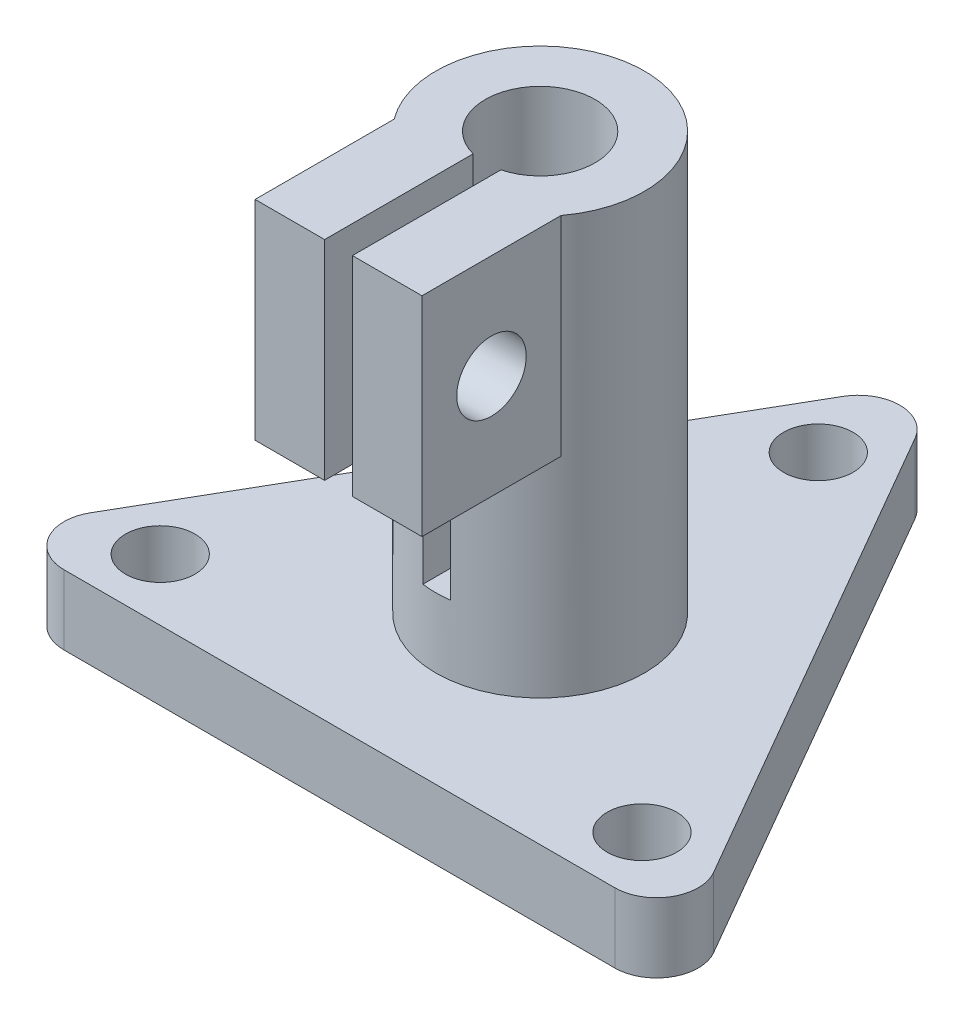
ISO-10303-21;
HEADER;
FILE_DESCRIPTION(('STEP AP214'),'2;1');
FILE_NAME('part.step','',(''),(''),'','','');
FILE_SCHEMA(('AUTOMOTIVE_DESIGN { 1 0 10303 214 1 1 1 1 }'));
ENDSEC;
DATA;
#1=APPLICATION_CONTEXT('core data for automotive mechanical design processes');
#2=APPLICATION_PROTOCOL_DEFINITION('international standard','automotive_design',2000,#1);
#3=PRODUCT_CONTEXT('',#1,'mechanical');
#4=PRODUCT('Part','Part','',(#3));
#5=PRODUCT_RELATED_PRODUCT_CATEGORY('part','',(#4));
#6=PRODUCT_DEFINITION_FORMATION('','',#4);
#7=PRODUCT_DEFINITION_CONTEXT('part definition',#1,'design');
#8=PRODUCT_DEFINITION('design','',#6,#7);
#9=PRODUCT_DEFINITION_SHAPE('','',#8);
#10=(LENGTH_UNIT() NAMED_UNIT(*) SI_UNIT(.MILLI.,.METRE.));
#11=(NAMED_UNIT(*) PLANE_ANGLE_UNIT() SI_UNIT($,.RADIAN.));
#12=(NAMED_UNIT(*) SI_UNIT($,.STERADIAN.) SOLID_ANGLE_UNIT());
#13=UNCERTAINTY_MEASURE_WITH_UNIT(LENGTH_MEASURE(1.E-05),#10,'distance_accuracy_value','');
#14=(GEOMETRIC_REPRESENTATION_CONTEXT(3) GLOBAL_UNCERTAINTY_ASSIGNED_CONTEXT((#13)) GLOBAL_UNIT_ASSIGNED_CONTEXT((#10,
#11,#12)) REPRESENTATION_CONTEXT('',''));
#15=CARTESIAN_POINT('',(0.,0.,0.));
#16=DIRECTION('',(0.,0.,1.));
#17=DIRECTION('',(1.,0.,0.));
#18=AXIS2_PLACEMENT_3D('',#15,#16,#17);
#19=CARTESIAN_POINT('',(-22.8038475772934,27.5,9.5));
#20=DIRECTION('',(1.,0.,0.));
#21=DIRECTION('',(0.,0.,-1.));
#22=AXIS2_PLACEMENT_3D('',#19,#20,#21);
#23=CYLINDRICAL_SURFACE('',#22,2.5);
#24=CARTESIAN_POINT('',(-1.,27.5,9.5));
#25=DIRECTION('',(-1.,0.,0.));
#26=DIRECTION('',(0.,0.,1.));
#27=AXIS2_PLACEMENT_3D('',#24,#25,#26);
#28=CIRCLE('',#27,2.5);
#29=CARTESIAN_POINT('',(-1.,27.5,12.));
#30=VERTEX_POINT('',#29);
#31=EDGE_CURVE('E246',#30,#30,#28,.T.);
#32=ORIENTED_EDGE('',*,*,#31,.F.);
#33=EDGE_LOOP('',(#32));
#34=FACE_BOUND('',#33,.T.);
#35=CARTESIAN_POINT('',(-1.5,27.5,9.5));
#36=DIRECTION('',(-1.,0.,0.));
#37=DIRECTION('',(0.,0.,1.));
#38=AXIS2_PLACEMENT_3D('',#35,#36,#37);
#39=CIRCLE('',#38,2.5);
#40=CARTESIAN_POINT('',(-1.5,27.5,12.));
#41=VERTEX_POINT('',#40);
#42=EDGE_CURVE('E40',#41,#41,#39,.F.);
#43=ORIENTED_EDGE('',*,*,#42,.F.);
#44=EDGE_LOOP('',(#43));
#45=FACE_BOUND('',#44,.T.);
#46=ADVANCED_FACE('F36',(#34,#45),#23,.F.);
#47=CARTESIAN_POINT('',(-6.,20.,14.5));
#48=DIRECTION('',(0.,0.,1.));
#49=DIRECTION('',(1.,0.,0.));
#50=AXIS2_PLACEMENT_3D('',#47,#48,#49);
#51=PLANE('',#50);
#52=DIRECTION('',(0.,1.,0.));
#53=VECTOR('',#52,1.);
#54=CARTESIAN_POINT('',(1.,9.99999999999999,14.5));
#55=LINE('',#54,#53);
#56=CARTESIAN_POINT('',(1.,20.,14.5));
#57=VERTEX_POINT('',#56);
#58=CARTESIAN_POINT('',(1.,35.,14.5));
#59=VERTEX_POINT('',#58);
#60=EDGE_CURVE('E268',#57,#59,#55,.T.);
#61=ORIENTED_EDGE('',*,*,#60,.F.);
#62=DIRECTION('',(1.,0.,0.));
#63=VECTOR('',#62,1.);
#64=CARTESIAN_POINT('',(-6.,20.,14.5));
#65=LINE('',#64,#63);
#66=CARTESIAN_POINT('',(6.,20.,14.5));
#67=VERTEX_POINT('',#66);
#68=EDGE_CURVE('E301',#57,#67,#65,.T.);
#69=ORIENTED_EDGE('',*,*,#68,.T.);
#70=DIRECTION('',(0.,1.,0.));
#71=VECTOR('',#70,1.);
#72=CARTESIAN_POINT('',(6.,20.,14.5));
#73=LINE('',#72,#71);
#74=CARTESIAN_POINT('',(6.,35.,14.5));
#75=VERTEX_POINT('',#74);
#76=EDGE_CURVE('E321',#67,#75,#73,.T.);
#77=ORIENTED_EDGE('',*,*,#76,.T.);
#78=DIRECTION('',(1.,0.,0.));
#79=VECTOR('',#78,1.);
#80=CARTESIAN_POINT('',(-6.,35.,14.5));
#81=LINE('',#80,#79);
#82=EDGE_CURVE('E311',#59,#75,#81,.T.);
#83=ORIENTED_EDGE('',*,*,#82,.F.);
#84=EDGE_LOOP('',(#61,#69,#77,#83));
#85=FACE_BOUND('',#84,.T.);
#86=ADVANCED_FACE('F397',(#85),#51,.T.);
#87=CARTESIAN_POINT('',(0.,20.,0.));
#88=DIRECTION('',(0.,1.,0.));
#89=DIRECTION('',(0.,0.,1.));
#90=AXIS2_PLACEMENT_3D('',#87,#88,#89);
#91=PLANE('',#90);
#92=ORIENTED_EDGE('',*,*,#68,.F.);
#93=DIRECTION('',(0.,0.,-1.));
#94=VECTOR('',#93,1.);
#95=CARTESIAN_POINT('',(1.,20.,0.));
#96=LINE('',#95,#94);
#97=CARTESIAN_POINT('',(1.,20.,7.43303437365925));
#98=VERTEX_POINT('',#97);
#99=EDGE_CURVE('E281',#57,#98,#96,.T.);
#100=ORIENTED_EDGE('',*,*,#99,.T.);
#101=CARTESIAN_POINT('',(0.,20.,0.));
#102=DIRECTION('',(0.,-1.,0.));
#103=DIRECTION('',(0.,0.,1.));
#104=AXIS2_PLACEMENT_3D('',#101,#102,#103);
#105=CIRCLE('',#104,7.5);
#106=CARTESIAN_POINT('',(6.,20.,4.5));
#107=VERTEX_POINT('',#106);
#108=EDGE_CURVE('E294',#107,#98,#105,.T.);
#109=ORIENTED_EDGE('',*,*,#108,.F.);
#110=DIRECTION('',(0.,0.,-1.));
#111=VECTOR('',#110,1.);
#112=CARTESIAN_POINT('',(6.,20.,4.5));
#113=LINE('',#112,#111);
#114=EDGE_CURVE('E305',#67,#107,#113,.T.);
#115=ORIENTED_EDGE('',*,*,#114,.F.);
#116=EDGE_LOOP('',(#92,#100,#109,#115));
#117=FACE_BOUND('',#116,.T.);
#118=ADVANCED_FACE('F449',(#117),#91,.F.);
#119=CARTESIAN_POINT('',(0.,5.,0.));
#120=DIRECTION('',(0.,1.,0.));
#121=DIRECTION('',(0.,0.,1.));
#122=AXIS2_PLACEMENT_3D('',#119,#120,#121);
#123=PLANE('',#122);
#124=CARTESIAN_POINT('',(0.,5.,0.));
#125=DIRECTION('',(0.,1.,0.));
#126=DIRECTION('',(0.,0.,1.));
#127=AXIS2_PLACEMENT_3D('',#124,#125,#126);
#128=CIRCLE('',#127,7.5);
#129=CARTESIAN_POINT('',(0.,5.,7.5));
#130=VERTEX_POINT('',#129);
#131=EDGE_CURVE('E320',#130,#130,#128,.T.);
#132=ORIENTED_EDGE('',*,*,#131,.F.);
#133=EDGE_LOOP('',(#132));
#134=FACE_BOUND('',#133,.T.);
#135=CARTESIAN_POINT('',(-17.3205080756888,5.,10.));
#136=DIRECTION('',(0.,1.,0.));
#137=DIRECTION('',(0.,0.,1.));
#138=AXIS2_PLACEMENT_3D('',#135,#136,#137);
#139=CIRCLE('',#138,2.5);
#140=CARTESIAN_POINT('',(-17.3205080756888,5.,12.5));
#141=VERTEX_POINT('',#140);
#142=EDGE_CURVE('E340',#141,#141,#139,.T.);
#143=ORIENTED_EDGE('',*,*,#142,.F.);
#144=EDGE_LOOP('',(#143));
#145=FACE_BOUND('',#144,.T.);
#146=DIRECTION('',(-0.5,0.,-0.866025403784439));
#147=VECTOR('',#146,1.);
#148=CARTESIAN_POINT('',(25.,5.,14.4337567297407));
#149=LINE('',#148,#147);
#150=CARTESIAN_POINT('',(22.4019237886467,5.,9.93375672974065));
#151=VERTEX_POINT('',#150);
#152=CARTESIAN_POINT('',(2.59807621135331,5.,-24.3675134594813));
#153=VERTEX_POINT('',#152);
#154=EDGE_CURVE('E358',#151,#153,#149,.T.);
#155=ORIENTED_EDGE('',*,*,#154,.T.);
#156=CARTESIAN_POINT('',(0.,5.,-22.8675134594813));
#157=DIRECTION('',(0.,1.,0.));
#158=DIRECTION('',(0.,0.,1.));
#159=AXIS2_PLACEMENT_3D('',#156,#157,#158);
#160=CIRCLE('',#159,3.);
#161=CARTESIAN_POINT('',(-2.59807621135331,5.,-24.3675134594813));
#162=VERTEX_POINT('',#161);
#163=EDGE_CURVE('E387',#153,#162,#160,.T.);
#164=ORIENTED_EDGE('',*,*,#163,.T.);
#165=DIRECTION('',(-0.5,0.,0.866025403784439));
#166=VECTOR('',#165,1.);
#167=CARTESIAN_POINT('',(0.,5.,-28.8675134594813));
#168=LINE('',#167,#166);
#169=CARTESIAN_POINT('',(-22.4019237886467,5.,9.93375672974065));
#170=VERTEX_POINT('',#169);
#171=EDGE_CURVE('E352',#162,#170,#168,.T.);
#172=ORIENTED_EDGE('',*,*,#171,.T.);
#173=CARTESIAN_POINT('',(-19.8038475772934,5.,11.4337567297406));
#174=DIRECTION('',(0.,1.,0.));
#175=DIRECTION('',(0.,0.,1.));
#176=AXIS2_PLACEMENT_3D('',#173,#174,#175);
#177=CIRCLE('',#176,3.);
#178=CARTESIAN_POINT('',(-19.8038475772934,5.,14.4337567297406));
#179=VERTEX_POINT('',#178);
#180=EDGE_CURVE('E385',#170,#179,#177,.T.);
#181=ORIENTED_EDGE('',*,*,#180,.T.);
#182=DIRECTION('',(1.,0.,0.));
#183=VECTOR('',#182,1.);
#184=CARTESIAN_POINT('',(-25.,5.,14.4337567297406));
#185=LINE('',#184,#183);
#186=CARTESIAN_POINT('',(19.8038475772934,5.,14.4337567297407));
#187=VERTEX_POINT('',#186);
#188=EDGE_CURVE('E355',#179,#187,#185,.T.);
#189=ORIENTED_EDGE('',*,*,#188,.T.);
#190=CARTESIAN_POINT('',(19.8038475772934,5.,11.4337567297407));
#191=DIRECTION('',(0.,1.,0.));
#192=DIRECTION('',(0.,0.,1.));
#193=AXIS2_PLACEMENT_3D('',#190,#191,#192);
#194=CIRCLE('',#193,3.);
#195=EDGE_CURVE('E383',#187,#151,#194,.T.);
#196=ORIENTED_EDGE('',*,*,#195,.T.);
#197=EDGE_LOOP('',(#155,#164,#172,#181,#189,#196));
#198=FACE_BOUND('',#197,.T.);
#199=CARTESIAN_POINT('',(0.,5.,-20.));
#200=DIRECTION('',(0.,1.,0.));
#201=DIRECTION('',(0.,0.,1.));
#202=AXIS2_PLACEMENT_3D('',#199,#200,#201);
#203=CIRCLE('',#202,2.5);
#204=CARTESIAN_POINT('',(0.,5.,-17.5));
#205=VERTEX_POINT('',#204);
#206=EDGE_CURVE('E346',#205,#205,#203,.T.);
#207=ORIENTED_EDGE('',*,*,#206,.F.);
#208=EDGE_LOOP('',(#207));
#209=FACE_BOUND('',#208,.T.);
#210=CARTESIAN_POINT('',(17.3205080756888,5.,10.));
#211=DIRECTION('',(0.,1.,0.));
#212=DIRECTION('',(0.,0.,1.));
#213=AXIS2_PLACEMENT_3D('',#210,#211,#212);
#214=CIRCLE('',#213,2.5);
#215=CARTESIAN_POINT('',(17.3205080756888,5.,12.5));
#216=VERTEX_POINT('',#215);
#217=EDGE_CURVE('E334',#216,#216,#214,.T.);
#218=ORIENTED_EDGE('',*,*,#217,.F.);
#219=EDGE_LOOP('',(#218));
#220=FACE_BOUND('',#219,.T.);
#221=ADVANCED_FACE('F482',(#134,#145,#198,#209,#220),#123,.T.);
#222=CARTESIAN_POINT('',(0.,0.,0.));
#223=DIRECTION('',(0.,1.,0.));
#224=DIRECTION('',(0.,0.,1.));
#225=AXIS2_PLACEMENT_3D('',#222,#223,#224);
#226=PLANE('',#225);
#227=CARTESIAN_POINT('',(0.,0.,0.));
#228=DIRECTION('',(0.,1.,0.));
#229=DIRECTION('',(0.,0.,1.));
#230=AXIS2_PLACEMENT_3D('',#227,#228,#229);
#231=CIRCLE('',#230,3.95);
#232=CARTESIAN_POINT('',(0.,0.,3.95));
#233=VERTEX_POINT('',#232);
#234=EDGE_CURVE('E288',#233,#233,#231,.T.);
#235=ORIENTED_EDGE('',*,*,#234,.T.);
#236=EDGE_LOOP('',(#235));
#237=FACE_BOUND('',#236,.T.);
#238=DIRECTION('',(-0.5,0.,0.866025403784439));
#239=VECTOR('',#238,1.);
#240=CARTESIAN_POINT('',(0.,0.,-28.8675134594813));
#241=LINE('',#240,#239);
#242=CARTESIAN_POINT('',(-2.59807621135331,0.,-24.3675134594813));
#243=VERTEX_POINT('',#242);
#244=CARTESIAN_POINT('',(-22.4019237886467,0.,9.93375672974065));
#245=VERTEX_POINT('',#244);
#246=EDGE_CURVE('E349',#243,#245,#241,.T.);
#247=ORIENTED_EDGE('',*,*,#246,.F.);
#248=CARTESIAN_POINT('',(0.,0.,-22.8675134594813));
#249=DIRECTION('',(0.,1.,0.));
#250=DIRECTION('',(0.,0.,1.));
#251=AXIS2_PLACEMENT_3D('',#248,#249,#250);
#252=CIRCLE('',#251,3.);
#253=CARTESIAN_POINT('',(2.59807621135331,0.,-24.3675134594813));
#254=VERTEX_POINT('',#253);
#255=EDGE_CURVE('E376',#243,#254,#252,.F.);
#256=ORIENTED_EDGE('',*,*,#255,.T.);
#257=DIRECTION('',(-0.5,0.,-0.866025403784439));
#258=VECTOR('',#257,1.);
#259=CARTESIAN_POINT('',(25.,0.,14.4337567297407));
#260=LINE('',#259,#258);
#261=CARTESIAN_POINT('',(22.4019237886467,0.,9.93375672974065));
#262=VERTEX_POINT('',#261);
#263=EDGE_CURVE('E356',#262,#254,#260,.T.);
#264=ORIENTED_EDGE('',*,*,#263,.F.);
#265=CARTESIAN_POINT('',(19.8038475772934,0.,11.4337567297407));
#266=DIRECTION('',(0.,1.,0.));
#267=DIRECTION('',(0.,0.,1.));
#268=AXIS2_PLACEMENT_3D('',#265,#266,#267);
#269=CIRCLE('',#268,3.);
#270=CARTESIAN_POINT('',(19.8038475772934,0.,14.4337567297407));
#271=VERTEX_POINT('',#270);
#272=EDGE_CURVE('E372',#262,#271,#269,.F.);
#273=ORIENTED_EDGE('',*,*,#272,.T.);
#274=DIRECTION('',(1.,0.,0.));
#275=VECTOR('',#274,1.);
#276=CARTESIAN_POINT('',(-25.,0.,14.4337567297406));
#277=LINE('',#276,#275);
#278=CARTESIAN_POINT('',(-19.8038475772934,0.,14.4337567297406));
#279=VERTEX_POINT('',#278);
#280=EDGE_CURVE('E364',#279,#271,#277,.T.);
#281=ORIENTED_EDGE('',*,*,#280,.F.);
#282=CARTESIAN_POINT('',(-19.8038475772934,0.,11.4337567297406));
#283=DIRECTION('',(0.,1.,0.));
#284=DIRECTION('',(0.,0.,1.));
#285=AXIS2_PLACEMENT_3D('',#282,#283,#284);
#286=CIRCLE('',#285,3.);
#287=EDGE_CURVE('E374',#279,#245,#286,.F.);
#288=ORIENTED_EDGE('',*,*,#287,.T.);
#289=EDGE_LOOP('',(#247,#256,#264,#273,#281,#288));
#290=FACE_BOUND('',#289,.T.);
#291=CARTESIAN_POINT('',(0.,0.,-20.));
#292=DIRECTION('',(0.,1.,0.));
#293=DIRECTION('',(0.,0.,1.));
#294=AXIS2_PLACEMENT_3D('',#291,#292,#293);
#295=CIRCLE('',#294,2.5);
#296=CARTESIAN_POINT('',(0.,0.,-17.5));
#297=VERTEX_POINT('',#296);
#298=EDGE_CURVE('E343',#297,#297,#295,.T.);
#299=ORIENTED_EDGE('',*,*,#298,.T.);
#300=EDGE_LOOP('',(#299));
#301=FACE_BOUND('',#300,.T.);
#302=CARTESIAN_POINT('',(-17.3205080756888,0.,10.));
#303=DIRECTION('',(0.,1.,0.));
#304=DIRECTION('',(0.,0.,1.));
#305=AXIS2_PLACEMENT_3D('',#302,#303,#304);
#306=CIRCLE('',#305,2.5);
#307=CARTESIAN_POINT('',(-17.3205080756888,0.,12.5));
#308=VERTEX_POINT('',#307);
#309=EDGE_CURVE('E337',#308,#308,#306,.T.);
#310=ORIENTED_EDGE('',*,*,#309,.T.);
#311=EDGE_LOOP('',(#310));
#312=FACE_BOUND('',#311,.T.);
#313=CARTESIAN_POINT('',(17.3205080756888,0.,10.));
#314=DIRECTION('',(0.,1.,0.));
#315=DIRECTION('',(0.,0.,1.));
#316=AXIS2_PLACEMENT_3D('',#313,#314,#315);
#317=CIRCLE('',#316,2.5);
#318=CARTESIAN_POINT('',(17.3205080756888,0.,12.5));
#319=VERTEX_POINT('',#318);
#320=EDGE_CURVE('E331',#319,#319,#317,.T.);
#321=ORIENTED_EDGE('',*,*,#320,.T.);
#322=EDGE_LOOP('',(#321));
#323=FACE_BOUND('',#322,.T.);
#324=ADVANCED_FACE('F485',(#237,#290,#301,#312,#323),#226,.F.);
#325=CARTESIAN_POINT('',(0.,5.,-28.8675134594813));
#326=DIRECTION('',(0.866025403784439,0.,0.5));
#327=DIRECTION('',(0.5,0.,-0.866025403784439));
#328=AXIS2_PLACEMENT_3D('',#325,#326,#327);
#329=PLANE('',#328);
#330=ORIENTED_EDGE('',*,*,#171,.F.);
#331=DIRECTION('',(0.,-1.,0.));
#332=VECTOR('',#331,1.);
#333=CARTESIAN_POINT('',(-2.59807621135331,5.,-24.3675134594813));
#334=LINE('',#333,#332);
#335=EDGE_CURVE('E369',#162,#243,#334,.T.);
#336=ORIENTED_EDGE('',*,*,#335,.T.);
#337=ORIENTED_EDGE('',*,*,#246,.T.);
#338=DIRECTION('',(0.,-1.,0.));
#339=VECTOR('',#338,1.);
#340=CARTESIAN_POINT('',(-22.4019237886467,5.,9.93375672974065));
#341=LINE('',#340,#339);
#342=EDGE_CURVE('E361',#245,#170,#341,.F.);
#343=ORIENTED_EDGE('',*,*,#342,.T.);
#344=EDGE_LOOP('',(#330,#336,#337,#343));
#345=FACE_BOUND('',#344,.T.);
#346=ADVANCED_FACE('F489',(#345),#329,.F.);
#347=CARTESIAN_POINT('',(-25.,5.,14.4337567297406));
#348=DIRECTION('',(0.,0.,-1.));
#349=DIRECTION('',(-1.,0.,0.));
#350=AXIS2_PLACEMENT_3D('',#347,#348,#349);
#351=PLANE('',#350);
#352=ORIENTED_EDGE('',*,*,#188,.F.);
#353=DIRECTION('',(0.,-1.,0.));
#354=VECTOR('',#353,1.);
#355=CARTESIAN_POINT('',(-19.8038475772934,5.,14.4337567297406));
#356=LINE('',#355,#354);
#357=EDGE_CURVE('E11',#179,#279,#356,.T.);
#358=ORIENTED_EDGE('',*,*,#357,.T.);
#359=ORIENTED_EDGE('',*,*,#280,.T.);
#360=DIRECTION('',(0.,-1.,0.));
#361=VECTOR('',#360,1.);
#362=CARTESIAN_POINT('',(19.8038475772934,5.,14.4337567297407));
#363=LINE('',#362,#361);
#364=EDGE_CURVE('E45',#271,#187,#363,.F.);
#365=ORIENTED_EDGE('',*,*,#364,.T.);
#366=EDGE_LOOP('',(#352,#358,#359,#365));
#367=FACE_BOUND('',#366,.T.);
#368=ADVANCED_FACE('F493',(#367),#351,.F.);
#369=CARTESIAN_POINT('',(25.,5.,14.4337567297407));
#370=DIRECTION('',(-0.866025403784439,0.,0.5));
#371=DIRECTION('',(0.5,0.,0.866025403784439));
#372=AXIS2_PLACEMENT_3D('',#369,#370,#371);
#373=PLANE('',#372);
#374=ORIENTED_EDGE('',*,*,#263,.T.);
#375=DIRECTION('',(0.,-1.,0.));
#376=VECTOR('',#375,1.);
#377=CARTESIAN_POINT('',(2.59807621135331,5.,-24.3675134594813));
#378=LINE('',#377,#376);
#379=EDGE_CURVE('E381',#254,#153,#378,.F.);
#380=ORIENTED_EDGE('',*,*,#379,.T.);
#381=ORIENTED_EDGE('',*,*,#154,.F.);
#382=DIRECTION('',(0.,-1.,0.));
#383=VECTOR('',#382,1.);
#384=CARTESIAN_POINT('',(22.4019237886467,5.,9.93375672974065));
#385=LINE('',#384,#383);
#386=EDGE_CURVE('E378',#151,#262,#385,.T.);
#387=ORIENTED_EDGE('',*,*,#386,.T.);
#388=EDGE_LOOP('',(#374,#380,#381,#387));
#389=FACE_BOUND('',#388,.T.);
#390=ADVANCED_FACE('F480',(#389),#373,.F.);
#391=CARTESIAN_POINT('',(0.,5.,-20.));
#392=DIRECTION('',(0.,-1.,0.));
#393=DIRECTION('',(0.,0.,-1.));
#394=AXIS2_PLACEMENT_3D('',#391,#392,#393);
#395=CYLINDRICAL_SURFACE('',#394,2.5);
#396=ORIENTED_EDGE('',*,*,#206,.T.);
#397=EDGE_LOOP('',(#396));
#398=FACE_BOUND('',#397,.T.);
#399=ORIENTED_EDGE('',*,*,#298,.F.);
#400=EDGE_LOOP('',(#399));
#401=FACE_BOUND('',#400,.T.);
#402=ADVANCED_FACE('F476',(#398,#401),#395,.F.);
#403=CARTESIAN_POINT('',(-17.3205080756888,5.,10.));
#404=DIRECTION('',(0.,-1.,0.));
#405=DIRECTION('',(0.,0.,-1.));
#406=AXIS2_PLACEMENT_3D('',#403,#404,#405);
#407=CYLINDRICAL_SURFACE('',#406,2.5);
#408=ORIENTED_EDGE('',*,*,#142,.T.);
#409=EDGE_LOOP('',(#408));
#410=FACE_BOUND('',#409,.T.);
#411=ORIENTED_EDGE('',*,*,#309,.F.);
#412=EDGE_LOOP('',(#411));
#413=FACE_BOUND('',#412,.T.);
#414=ADVANCED_FACE('F472',(#410,#413),#407,.F.);
#415=CARTESIAN_POINT('',(17.3205080756888,5.,10.));
#416=DIRECTION('',(0.,-1.,0.));
#417=DIRECTION('',(0.,0.,-1.));
#418=AXIS2_PLACEMENT_3D('',#415,#416,#417);
#419=CYLINDRICAL_SURFACE('',#418,2.5);
#420=ORIENTED_EDGE('',*,*,#217,.T.);
#421=EDGE_LOOP('',(#420));
#422=FACE_BOUND('',#421,.T.);
#423=ORIENTED_EDGE('',*,*,#320,.F.);
#424=EDGE_LOOP('',(#423));
#425=FACE_BOUND('',#424,.T.);
#426=ADVANCED_FACE('F468',(#422,#425),#419,.F.);
#427=CARTESIAN_POINT('',(0.,35.,0.));
#428=DIRECTION('',(0.,-1.,0.));
#429=DIRECTION('',(0.,0.,-1.));
#430=AXIS2_PLACEMENT_3D('',#427,#428,#429);
#431=CYLINDRICAL_SURFACE('',#430,7.5);
#432=ORIENTED_EDGE('',*,*,#108,.T.);
#433=DIRECTION('',(0.,-1.,0.));
#434=VECTOR('',#433,1.);
#435=CARTESIAN_POINT('',(1.,35.,7.43303437365925));
#436=LINE('',#435,#434);
#437=CARTESIAN_POINT('',(1.,9.99999999999999,7.43303437365925));
#438=VERTEX_POINT('',#437);
#439=EDGE_CURVE('E284',#98,#438,#436,.T.);
#440=ORIENTED_EDGE('',*,*,#439,.T.);
#441=CARTESIAN_POINT('',(0.,9.99999999999999,0.));
#442=DIRECTION('',(0.,1.,0.));
#443=DIRECTION('',(0.,0.,1.));
#444=AXIS2_PLACEMENT_3D('',#441,#442,#443);
#445=CIRCLE('',#444,7.5);
#446=CARTESIAN_POINT('',(-1.,9.99999999999999,7.43303437365925));
#447=VERTEX_POINT('',#446);
#448=EDGE_CURVE('E267',#447,#438,#445,.T.);
#449=ORIENTED_EDGE('',*,*,#448,.F.);
#450=DIRECTION('',(0.,-1.,0.));
#451=VECTOR('',#450,1.);
#452=CARTESIAN_POINT('',(-1.,35.,7.43303437365925));
#453=LINE('',#452,#451);
#454=CARTESIAN_POINT('',(-1.,20.,7.43303437365925));
#455=VERTEX_POINT('',#454);
#456=EDGE_CURVE('E278',#447,#455,#453,.F.);
#457=ORIENTED_EDGE('',*,*,#456,.T.);
#458=CARTESIAN_POINT('',(-6.,20.,4.5));
#459=VERTEX_POINT('',#458);
#460=EDGE_CURVE('E298',#455,#459,#105,.T.);
#461=ORIENTED_EDGE('',*,*,#460,.T.);
#462=DIRECTION('',(0.,1.,0.));
#463=VECTOR('',#462,1.);
#464=CARTESIAN_POINT('',(-6.,20.,4.5));
#465=LINE('',#464,#463);
#466=CARTESIAN_POINT('',(-6.,35.,4.5));
#467=VERTEX_POINT('',#466);
#468=EDGE_CURVE('E308',#459,#467,#465,.T.);
#469=ORIENTED_EDGE('',*,*,#468,.T.);
#470=CARTESIAN_POINT('',(0.,35.,0.));
#471=DIRECTION('',(0.,1.,0.));
#472=DIRECTION('',(0.,0.,1.));
#473=AXIS2_PLACEMENT_3D('',#470,#471,#472);
#474=CIRCLE('',#473,7.5);
#475=CARTESIAN_POINT('',(6.,35.,4.5));
#476=VERTEX_POINT('',#475);
#477=EDGE_CURVE('E328',#476,#467,#474,.T.);
#478=ORIENTED_EDGE('',*,*,#477,.F.);
#479=DIRECTION('',(0.,1.,0.));
#480=VECTOR('',#479,1.);
#481=CARTESIAN_POINT('',(6.,20.,4.5));
#482=LINE('',#481,#480);
#483=EDGE_CURVE('E317',#107,#476,#482,.T.);
#484=ORIENTED_EDGE('',*,*,#483,.F.);
#485=EDGE_LOOP('',(#432,#440,#449,#457,#461,#469,#478,#484));
#486=FACE_BOUND('',#485,.T.);
#487=ORIENTED_EDGE('',*,*,#131,.T.);
#488=EDGE_LOOP('',(#487));
#489=FACE_BOUND('',#488,.T.);
#490=ADVANCED_FACE('F464',(#486,#489),#431,.T.);
#491=CARTESIAN_POINT('',(0.,35.,0.));
#492=DIRECTION('',(0.,1.,0.));
#493=DIRECTION('',(0.,0.,1.));
#494=AXIS2_PLACEMENT_3D('',#491,#492,#493);
#495=PLANE('',#494);
#496=DIRECTION('',(0.,0.,-1.));
#497=VECTOR('',#496,1.);
#498=CARTESIAN_POINT('',(1.,35.,3.8213217608571));
#499=LINE('',#498,#497);
#500=CARTESIAN_POINT('',(1.,35.,3.8213217608571));
#501=VERTEX_POINT('',#500);
#502=EDGE_CURVE('E255',#59,#501,#499,.T.);
#503=ORIENTED_EDGE('',*,*,#502,.F.);
#504=ORIENTED_EDGE('',*,*,#82,.T.);
#505=DIRECTION('',(0.,0.,-1.));
#506=VECTOR('',#505,1.);
#507=CARTESIAN_POINT('',(6.,35.,4.5));
#508=LINE('',#507,#506);
#509=EDGE_CURVE('E315',#75,#476,#508,.T.);
#510=ORIENTED_EDGE('',*,*,#509,.T.);
#511=ORIENTED_EDGE('',*,*,#477,.T.);
#512=DIRECTION('',(0.,0.,1.));
#513=VECTOR('',#512,1.);
#514=CARTESIAN_POINT('',(-6.,35.,4.5));
#515=LINE('',#514,#513);
#516=CARTESIAN_POINT('',(-6.,35.,14.5));
#517=VERTEX_POINT('',#516);
#518=EDGE_CURVE('E291',#467,#517,#515,.T.);
#519=ORIENTED_EDGE('',*,*,#518,.T.);
#520=CARTESIAN_POINT('',(-1.,35.,14.5));
#521=VERTEX_POINT('',#520);
#522=EDGE_CURVE('E312',#517,#521,#81,.T.);
#523=ORIENTED_EDGE('',*,*,#522,.T.);
#524=DIRECTION('',(0.,0.,1.));
#525=VECTOR('',#524,1.);
#526=CARTESIAN_POINT('',(-1.,35.,3.8213217608571));
#527=LINE('',#526,#525);
#528=CARTESIAN_POINT('',(-1.,35.,3.8213217608571));
#529=VERTEX_POINT('',#528);
#530=EDGE_CURVE('E250',#529,#521,#527,.T.);
#531=ORIENTED_EDGE('',*,*,#530,.F.);
#532=CARTESIAN_POINT('',(0.,35.,0.));
#533=DIRECTION('',(0.,1.,0.));
#534=DIRECTION('',(0.,0.,1.));
#535=AXIS2_PLACEMENT_3D('',#532,#533,#534);
#536=CIRCLE('',#535,3.95);
#537=EDGE_CURVE('E287',#501,#529,#536,.T.);
#538=ORIENTED_EDGE('',*,*,#537,.F.);
#539=EDGE_LOOP('',(#503,#504,#510,#511,#519,#523,#531,#538));
#540=FACE_BOUND('',#539,.T.);
#541=ADVANCED_FACE('F454',(#540),#495,.T.);
#542=CARTESIAN_POINT('',(6.,20.,4.5));
#543=DIRECTION('',(1.,0.,0.));
#544=DIRECTION('',(0.,0.,-1.));
#545=AXIS2_PLACEMENT_3D('',#542,#543,#544);
#546=PLANE('',#545);
#547=CARTESIAN_POINT('',(6.,27.5,9.5));
#548=DIRECTION('',(1.,0.,0.));
#549=DIRECTION('',(0.,0.,-1.));
#550=AXIS2_PLACEMENT_3D('',#547,#548,#549);
#551=CIRCLE('',#550,2.5);
#552=CARTESIAN_POINT('',(6.,27.5,7.));
#553=VERTEX_POINT('',#552);
#554=EDGE_CURVE('E243',#553,#553,#551,.T.);
#555=ORIENTED_EDGE('',*,*,#554,.F.);
#556=EDGE_LOOP('',(#555));
#557=FACE_BOUND('',#556,.T.);
#558=ORIENTED_EDGE('',*,*,#509,.F.);
#559=ORIENTED_EDGE('',*,*,#76,.F.);
#560=ORIENTED_EDGE('',*,*,#114,.T.);
#561=ORIENTED_EDGE('',*,*,#483,.T.);
#562=EDGE_LOOP('',(#558,#559,#560,#561));
#563=FACE_BOUND('',#562,.T.);
#564=ADVANCED_FACE('F450',(#557,#563),#546,.T.);
#565=DIRECTION('',(0.,1.,0.));
#566=VECTOR('',#565,1.);
#567=CARTESIAN_POINT('',(-1.,9.99999999999999,14.5));
#568=LINE('',#567,#566);
#569=CARTESIAN_POINT('',(-1.,20.,14.5));
#570=VERTEX_POINT('',#569);
#571=EDGE_CURVE('E270',#570,#521,#568,.T.);
#572=ORIENTED_EDGE('',*,*,#571,.T.);
#573=ORIENTED_EDGE('',*,*,#522,.F.);
#574=DIRECTION('',(0.,1.,0.));
#575=VECTOR('',#574,1.);
#576=CARTESIAN_POINT('',(-6.,20.,14.5));
#577=LINE('',#576,#575);
#578=CARTESIAN_POINT('',(-6.,20.,14.5));
#579=VERTEX_POINT('',#578);
#580=EDGE_CURVE('E324',#579,#517,#577,.T.);
#581=ORIENTED_EDGE('',*,*,#580,.F.);
#582=EDGE_CURVE('E302',#579,#570,#65,.T.);
#583=ORIENTED_EDGE('',*,*,#582,.T.);
#584=EDGE_LOOP('',(#572,#573,#581,#583));
#585=FACE_BOUND('',#584,.T.);
#586=ADVANCED_FACE('F453',(#585),#51,.T.);
#587=CARTESIAN_POINT('',(-6.,20.,4.5));
#588=DIRECTION('',(-1.,0.,0.));
#589=DIRECTION('',(0.,0.,1.));
#590=AXIS2_PLACEMENT_3D('',#587,#588,#589);
#591=PLANE('',#590);
#592=DIRECTION('',(0.,0.866025403784439,-0.5));
#593=VECTOR('',#592,1.);
#594=CARTESIAN_POINT('',(-6.,27.5,14.0726141319818));
#595=LINE('',#594,#593);
#596=CARTESIAN_POINT('',(-6.,27.5,14.0726141319818));
#597=VERTEX_POINT('',#596);
#598=CARTESIAN_POINT('',(-6.,31.46,11.7863070659909));
#599=VERTEX_POINT('',#598);
#600=EDGE_CURVE('E53',#597,#599,#595,.T.);
#601=ORIENTED_EDGE('',*,*,#600,.F.);
#602=DIRECTION('',(0.,0.866025403784439,0.5));
#603=VECTOR('',#602,1.);
#604=CARTESIAN_POINT('',(-6.,23.54,11.7863070659909));
#605=LINE('',#604,#603);
#606=CARTESIAN_POINT('',(-6.,23.54,11.7863070659909));
#607=VERTEX_POINT('',#606);
#608=EDGE_CURVE('E210',#607,#597,#605,.T.);
#609=ORIENTED_EDGE('',*,*,#608,.F.);
#610=DIRECTION('',(0.,0.,1.));
#611=VECTOR('',#610,1.);
#612=CARTESIAN_POINT('',(-6.,23.54,7.21369293400908));
#613=LINE('',#612,#611);
#614=CARTESIAN_POINT('',(-6.,23.54,7.21369293400908));
#615=VERTEX_POINT('',#614);
#616=EDGE_CURVE('E213',#615,#607,#613,.T.);
#617=ORIENTED_EDGE('',*,*,#616,.F.);
#618=DIRECTION('',(0.,-0.866025403784439,0.5));
#619=VECTOR('',#618,1.);
#620=CARTESIAN_POINT('',(-6.,27.5,4.92738586801816));
#621=LINE('',#620,#619);
#622=CARTESIAN_POINT('',(-6.,27.5,4.92738586801816));
#623=VERTEX_POINT('',#622);
#624=EDGE_CURVE('E229',#623,#615,#621,.T.);
#625=ORIENTED_EDGE('',*,*,#624,.F.);
#626=DIRECTION('',(0.,-0.866025403784439,-0.5));
#627=VECTOR('',#626,1.);
#628=CARTESIAN_POINT('',(-6.,31.46,7.21369293400908));
#629=LINE('',#628,#627);
#630=CARTESIAN_POINT('',(-6.,31.46,7.21369293400908));
#631=VERTEX_POINT('',#630);
#632=EDGE_CURVE('E226',#631,#623,#629,.T.);
#633=ORIENTED_EDGE('',*,*,#632,.F.);
#634=DIRECTION('',(0.,0.,-1.));
#635=VECTOR('',#634,1.);
#636=CARTESIAN_POINT('',(-6.,31.46,11.7863070659909));
#637=LINE('',#636,#635);
#638=EDGE_CURVE('E224',#599,#631,#637,.T.);
#639=ORIENTED_EDGE('',*,*,#638,.F.);
#640=EDGE_LOOP('',(#601,#609,#617,#625,#633,#639));
#641=FACE_BOUND('',#640,.T.);
#642=ORIENTED_EDGE('',*,*,#518,.F.);
#643=ORIENTED_EDGE('',*,*,#468,.F.);
#644=DIRECTION('',(0.,0.,1.));
#645=VECTOR('',#644,1.);
#646=CARTESIAN_POINT('',(-6.,20.,4.5));
#647=LINE('',#646,#645);
#648=EDGE_CURVE('E297',#459,#579,#647,.T.);
#649=ORIENTED_EDGE('',*,*,#648,.T.);
#650=ORIENTED_EDGE('',*,*,#580,.T.);
#651=EDGE_LOOP('',(#642,#643,#649,#650));
#652=FACE_BOUND('',#651,.T.);
#653=ADVANCED_FACE('F447',(#641,#652),#591,.T.);
#654=ORIENTED_EDGE('',*,*,#460,.F.);
#655=DIRECTION('',(0.,0.,1.));
#656=VECTOR('',#655,1.);
#657=CARTESIAN_POINT('',(-1.,20.,0.));
#658=LINE('',#657,#656);
#659=EDGE_CURVE('E275',#455,#570,#658,.T.);
#660=ORIENTED_EDGE('',*,*,#659,.T.);
#661=ORIENTED_EDGE('',*,*,#582,.F.);
#662=ORIENTED_EDGE('',*,*,#648,.F.);
#663=EDGE_LOOP('',(#654,#660,#661,#662));
#664=FACE_BOUND('',#663,.T.);
#665=ADVANCED_FACE('F443',(#664),#91,.F.);
#666=CARTESIAN_POINT('',(0.,0.,0.));
#667=DIRECTION('',(0.,1.,0.));
#668=DIRECTION('',(0.,0.,1.));
#669=AXIS2_PLACEMENT_3D('',#666,#667,#668);
#670=CYLINDRICAL_SURFACE('',#669,3.95);
#671=ORIENTED_EDGE('',*,*,#234,.F.);
#672=EDGE_LOOP('',(#671));
#673=FACE_BOUND('',#672,.T.);
#674=CARTESIAN_POINT('',(0.,9.99999999999999,0.));
#675=DIRECTION('',(0.,-1.,0.));
#676=DIRECTION('',(0.,0.,1.));
#677=AXIS2_PLACEMENT_3D('',#674,#675,#676);
#678=CIRCLE('',#677,3.95);
#679=CARTESIAN_POINT('',(1.,9.99999999999999,3.8213217608571));
#680=VERTEX_POINT('',#679);
#681=CARTESIAN_POINT('',(-1.,9.99999999999999,3.8213217608571));
#682=VERTEX_POINT('',#681);
#683=EDGE_CURVE('E251',#680,#682,#678,.T.);
#684=ORIENTED_EDGE('',*,*,#683,.F.);
#685=DIRECTION('',(0.,1.,0.));
#686=VECTOR('',#685,1.);
#687=CARTESIAN_POINT('',(1.,9.99999999999999,3.8213217608571));
#688=LINE('',#687,#686);
#689=EDGE_CURVE('E264',#680,#501,#688,.T.);
#690=ORIENTED_EDGE('',*,*,#689,.T.);
#691=ORIENTED_EDGE('',*,*,#537,.T.);
#692=DIRECTION('',(0.,1.,0.));
#693=VECTOR('',#692,1.);
#694=CARTESIAN_POINT('',(-1.,9.99999999999999,3.8213217608571));
#695=LINE('',#694,#693);
#696=EDGE_CURVE('E261',#682,#529,#695,.T.);
#697=ORIENTED_EDGE('',*,*,#696,.F.);
#698=EDGE_LOOP('',(#684,#690,#691,#697));
#699=FACE_BOUND('',#698,.T.);
#700=ADVANCED_FACE('F437',(#673,#699),#670,.F.);
#701=CARTESIAN_POINT('',(1.,9.99999999999999,3.8213217608571));
#702=DIRECTION('',(1.,0.,0.));
#703=DIRECTION('',(0.,0.,-1.));
#704=AXIS2_PLACEMENT_3D('',#701,#702,#703);
#705=PLANE('',#704);
#706=CARTESIAN_POINT('',(1.,27.5,9.5));
#707=DIRECTION('',(1.,0.,0.));
#708=DIRECTION('',(0.,0.,-1.));
#709=AXIS2_PLACEMENT_3D('',#706,#707,#708);
#710=CIRCLE('',#709,2.5);
#711=CARTESIAN_POINT('',(1.,27.5,7.));
#712=VERTEX_POINT('',#711);
#713=EDGE_CURVE('E247',#712,#712,#710,.T.);
#714=ORIENTED_EDGE('',*,*,#713,.T.);
#715=EDGE_LOOP('',(#714));
#716=FACE_BOUND('',#715,.T.);
#717=ORIENTED_EDGE('',*,*,#99,.F.);
#718=ORIENTED_EDGE('',*,*,#60,.T.);
#719=ORIENTED_EDGE('',*,*,#502,.T.);
#720=ORIENTED_EDGE('',*,*,#689,.F.);
#721=DIRECTION('',(0.,0.,-1.));
#722=VECTOR('',#721,1.);
#723=CARTESIAN_POINT('',(1.,9.99999999999999,3.8213217608571));
#724=LINE('',#723,#722);
#725=EDGE_CURVE('E258',#438,#680,#724,.T.);
#726=ORIENTED_EDGE('',*,*,#725,.F.);
#727=ORIENTED_EDGE('',*,*,#439,.F.);
#728=EDGE_LOOP('',(#717,#718,#719,#720,#726,#727));
#729=FACE_BOUND('',#728,.T.);
#730=ADVANCED_FACE('F434',(#716,#729),#705,.F.);
#731=CARTESIAN_POINT('',(-1.,9.99999999999999,3.8213217608571));
#732=DIRECTION('',(-1.,0.,0.));
#733=DIRECTION('',(0.,0.,1.));
#734=AXIS2_PLACEMENT_3D('',#731,#732,#733);
#735=PLANE('',#734);
#736=ORIENTED_EDGE('',*,*,#31,.T.);
#737=EDGE_LOOP('',(#736));
#738=FACE_BOUND('',#737,.T.);
#739=DIRECTION('',(0.,0.,1.));
#740=VECTOR('',#739,1.);
#741=CARTESIAN_POINT('',(-1.,9.99999999999999,3.8213217608571));
#742=LINE('',#741,#740);
#743=EDGE_CURVE('E254',#682,#447,#742,.T.);
#744=ORIENTED_EDGE('',*,*,#743,.F.);
#745=ORIENTED_EDGE('',*,*,#696,.T.);
#746=ORIENTED_EDGE('',*,*,#530,.T.);
#747=ORIENTED_EDGE('',*,*,#571,.F.);
#748=ORIENTED_EDGE('',*,*,#659,.F.);
#749=ORIENTED_EDGE('',*,*,#456,.F.);
#750=EDGE_LOOP('',(#744,#745,#746,#747,#748,#749));
#751=FACE_BOUND('',#750,.T.);
#752=ADVANCED_FACE('F392',(#738,#751),#735,.F.);
#753=CARTESIAN_POINT('',(0.,9.99999999999999,0.));
#754=DIRECTION('',(0.,1.,0.));
#755=DIRECTION('',(0.,0.,1.));
#756=AXIS2_PLACEMENT_3D('',#753,#754,#755);
#757=PLANE('',#756);
#758=ORIENTED_EDGE('',*,*,#448,.T.);
#759=ORIENTED_EDGE('',*,*,#725,.T.);
#760=ORIENTED_EDGE('',*,*,#683,.T.);
#761=ORIENTED_EDGE('',*,*,#743,.T.);
#762=EDGE_LOOP('',(#758,#759,#760,#761));
#763=FACE_BOUND('',#762,.T.);
#764=ADVANCED_FACE('F429',(#763),#757,.T.);
#765=CARTESIAN_POINT('',(0.,5.,-22.8675134594813));
#766=DIRECTION('',(0.,-1.,0.));
#767=DIRECTION('',(0.,0.,-1.));
#768=AXIS2_PLACEMENT_3D('',#765,#766,#767);
#769=CYLINDRICAL_SURFACE('',#768,3.);
#770=ORIENTED_EDGE('',*,*,#163,.F.);
#771=ORIENTED_EDGE('',*,*,#379,.F.);
#772=ORIENTED_EDGE('',*,*,#255,.F.);
#773=ORIENTED_EDGE('',*,*,#335,.F.);
#774=EDGE_LOOP('',(#770,#771,#772,#773));
#775=FACE_BOUND('',#774,.T.);
#776=ADVANCED_FACE('F432',(#775),#769,.T.);
#777=CARTESIAN_POINT('',(-19.8038475772934,5.,11.4337567297406));
#778=DIRECTION('',(0.,-1.,0.));
#779=DIRECTION('',(0.,0.,-1.));
#780=AXIS2_PLACEMENT_3D('',#777,#778,#779);
#781=CYLINDRICAL_SURFACE('',#780,3.);
#782=ORIENTED_EDGE('',*,*,#180,.F.);
#783=ORIENTED_EDGE('',*,*,#342,.F.);
#784=ORIENTED_EDGE('',*,*,#287,.F.);
#785=ORIENTED_EDGE('',*,*,#357,.F.);
#786=EDGE_LOOP('',(#782,#783,#784,#785));
#787=FACE_BOUND('',#786,.T.);
#788=ADVANCED_FACE('F501',(#787),#781,.T.);
#789=CARTESIAN_POINT('',(19.8038475772934,5.,11.4337567297407));
#790=DIRECTION('',(0.,-1.,0.));
#791=DIRECTION('',(0.,0.,-1.));
#792=AXIS2_PLACEMENT_3D('',#789,#790,#791);
#793=CYLINDRICAL_SURFACE('',#792,3.);
#794=ORIENTED_EDGE('',*,*,#195,.F.);
#795=ORIENTED_EDGE('',*,*,#364,.F.);
#796=ORIENTED_EDGE('',*,*,#272,.F.);
#797=ORIENTED_EDGE('',*,*,#386,.F.);
#798=EDGE_LOOP('',(#794,#795,#796,#797));
#799=FACE_BOUND('',#798,.T.);
#800=ADVANCED_FACE('F38',(#799),#793,.T.);
#801=ORIENTED_EDGE('',*,*,#554,.T.);
#802=EDGE_LOOP('',(#801));
#803=FACE_BOUND('',#802,.T.);
#804=ORIENTED_EDGE('',*,*,#713,.F.);
#805=EDGE_LOOP('',(#804));
#806=FACE_BOUND('',#805,.T.);
#807=ADVANCED_FACE('F399',(#803,#806),#23,.F.);
#808=CARTESIAN_POINT('',(-1.5,0.,0.));
#809=DIRECTION('',(-1.,0.,0.));
#810=DIRECTION('',(0.,0.,1.));
#811=AXIS2_PLACEMENT_3D('',#808,#809,#810);
#812=PLANE('',#811);
#813=DIRECTION('',(0.,0.866025403784439,-0.5));
#814=VECTOR('',#813,1.);
#815=CARTESIAN_POINT('',(-1.5,27.5,14.0726141319818));
#816=LINE('',#815,#814);
#817=CARTESIAN_POINT('',(-1.5,27.5,14.0726141319818));
#818=VERTEX_POINT('',#817);
#819=CARTESIAN_POINT('',(-1.5,31.46,11.7863070659909));
#820=VERTEX_POINT('',#819);
#821=EDGE_CURVE('E190',#818,#820,#816,.T.);
#822=ORIENTED_EDGE('',*,*,#821,.T.);
#823=DIRECTION('',(0.,0.,-1.));
#824=VECTOR('',#823,1.);
#825=CARTESIAN_POINT('',(-1.5,31.46,11.7863070659909));
#826=LINE('',#825,#824);
#827=CARTESIAN_POINT('',(-1.5,31.46,7.21369293400908));
#828=VERTEX_POINT('',#827);
#829=EDGE_CURVE('E199',#820,#828,#826,.T.);
#830=ORIENTED_EDGE('',*,*,#829,.T.);
#831=DIRECTION('',(0.,-0.866025403784439,-0.5));
#832=VECTOR('',#831,1.);
#833=CARTESIAN_POINT('',(-1.5,31.46,7.21369293400908));
#834=LINE('',#833,#832);
#835=CARTESIAN_POINT('',(-1.5,27.5,4.92738586801816));
#836=VERTEX_POINT('',#835);
#837=EDGE_CURVE('E204',#828,#836,#834,.T.);
#838=ORIENTED_EDGE('',*,*,#837,.T.);
#839=DIRECTION('',(0.,-0.866025403784439,0.5));
#840=VECTOR('',#839,1.);
#841=CARTESIAN_POINT('',(-1.5,27.5,4.92738586801816));
#842=LINE('',#841,#840);
#843=CARTESIAN_POINT('',(-1.5,23.54,7.21369293400908));
#844=VERTEX_POINT('',#843);
#845=EDGE_CURVE('E217',#836,#844,#842,.T.);
#846=ORIENTED_EDGE('',*,*,#845,.T.);
#847=DIRECTION('',(0.,0.,1.));
#848=VECTOR('',#847,1.);
#849=CARTESIAN_POINT('',(-1.5,23.54,7.21369293400908));
#850=LINE('',#849,#848);
#851=CARTESIAN_POINT('',(-1.5,23.54,11.7863070659909));
#852=VERTEX_POINT('',#851);
#853=EDGE_CURVE('E220',#844,#852,#850,.T.);
#854=ORIENTED_EDGE('',*,*,#853,.T.);
#855=DIRECTION('',(0.,0.866025403784439,0.5));
#856=VECTOR('',#855,1.);
#857=CARTESIAN_POINT('',(-1.5,23.54,11.7863070659909));
#858=LINE('',#857,#856);
#859=EDGE_CURVE('E196',#852,#818,#858,.T.);
#860=ORIENTED_EDGE('',*,*,#859,.T.);
#861=EDGE_LOOP('',(#822,#830,#838,#846,#854,#860));
#862=FACE_BOUND('',#861,.T.);
#863=ORIENTED_EDGE('',*,*,#42,.T.);
#864=EDGE_LOOP('',(#863));
#865=FACE_BOUND('',#864,.T.);
#866=ADVANCED_FACE('F206',(#862,#865),#812,.T.);
#867=CARTESIAN_POINT('',(-1.5,27.5,14.0726141319818));
#868=DIRECTION('',(0.,0.5,0.866025403784439));
#869=DIRECTION('',(0.,-0.866025403784439,0.5));
#870=AXIS2_PLACEMENT_3D('',#867,#868,#869);
#871=PLANE('',#870);
#872=ORIENTED_EDGE('',*,*,#600,.T.);
#873=DIRECTION('',(-1.,0.,0.));
#874=VECTOR('',#873,1.);
#875=CARTESIAN_POINT('',(-1.5,31.46,11.7863070659909));
#876=LINE('',#875,#874);
#877=EDGE_CURVE('E186',#820,#599,#876,.T.);
#878=ORIENTED_EDGE('',*,*,#877,.F.);
#879=ORIENTED_EDGE('',*,*,#821,.F.);
#880=DIRECTION('',(-1.,0.,0.));
#881=VECTOR('',#880,1.);
#882=CARTESIAN_POINT('',(-1.5,27.5,14.0726141319818));
#883=LINE('',#882,#881);
#884=EDGE_CURVE('E234',#818,#597,#883,.T.);
#885=ORIENTED_EDGE('',*,*,#884,.T.);
#886=EDGE_LOOP('',(#872,#878,#879,#885));
#887=FACE_BOUND('',#886,.T.);
#888=ADVANCED_FACE('F188',(#887),#871,.F.);
#889=CARTESIAN_POINT('',(-1.5,23.54,11.7863070659909));
#890=DIRECTION('',(0.,-0.5,0.866025403784439));
#891=DIRECTION('',(0.,-0.866025403784439,-0.5));
#892=AXIS2_PLACEMENT_3D('',#889,#890,#891);
#893=PLANE('',#892);
#894=ORIENTED_EDGE('',*,*,#608,.T.);
#895=ORIENTED_EDGE('',*,*,#884,.F.);
#896=ORIENTED_EDGE('',*,*,#859,.F.);
#897=DIRECTION('',(-1.,0.,0.));
#898=VECTOR('',#897,1.);
#899=CARTESIAN_POINT('',(-1.5,23.54,11.7863070659909));
#900=LINE('',#899,#898);
#901=EDGE_CURVE('E236',#852,#607,#900,.T.);
#902=ORIENTED_EDGE('',*,*,#901,.T.);
#903=EDGE_LOOP('',(#894,#895,#896,#902));
#904=FACE_BOUND('',#903,.T.);
#905=ADVANCED_FACE('F408',(#904),#893,.F.);
#906=CARTESIAN_POINT('',(-1.5,23.54,7.21369293400908));
#907=DIRECTION('',(0.,-1.,0.));
#908=DIRECTION('',(0.,0.,-1.));
#909=AXIS2_PLACEMENT_3D('',#906,#907,#908);
#910=PLANE('',#909);
#911=ORIENTED_EDGE('',*,*,#616,.T.);
#912=ORIENTED_EDGE('',*,*,#901,.F.);
#913=ORIENTED_EDGE('',*,*,#853,.F.);
#914=DIRECTION('',(-1.,0.,0.));
#915=VECTOR('',#914,1.);
#916=CARTESIAN_POINT('',(-1.5,23.54,7.21369293400908));
#917=LINE('',#916,#915);
#918=EDGE_CURVE('E238',#844,#615,#917,.T.);
#919=ORIENTED_EDGE('',*,*,#918,.T.);
#920=EDGE_LOOP('',(#911,#912,#913,#919));
#921=FACE_BOUND('',#920,.T.);
#922=ADVANCED_FACE('F414',(#921),#910,.F.);
#923=CARTESIAN_POINT('',(-1.5,27.5,4.92738586801816));
#924=DIRECTION('',(0.,-0.5,-0.866025403784439));
#925=DIRECTION('',(0.,0.866025403784439,-0.5));
#926=AXIS2_PLACEMENT_3D('',#923,#924,#925);
#927=PLANE('',#926);
#928=ORIENTED_EDGE('',*,*,#624,.T.);
#929=ORIENTED_EDGE('',*,*,#918,.F.);
#930=ORIENTED_EDGE('',*,*,#845,.F.);
#931=DIRECTION('',(-1.,0.,0.));
#932=VECTOR('',#931,1.);
#933=CARTESIAN_POINT('',(-1.5,27.5,4.92738586801816));
#934=LINE('',#933,#932);
#935=EDGE_CURVE('E240',#836,#623,#934,.T.);
#936=ORIENTED_EDGE('',*,*,#935,.T.);
#937=EDGE_LOOP('',(#928,#929,#930,#936));
#938=FACE_BOUND('',#937,.T.);
#939=ADVANCED_FACE('F418',(#938),#927,.F.);
#940=CARTESIAN_POINT('',(-1.5,31.46,7.21369293400908));
#941=DIRECTION('',(0.,0.5,-0.866025403784439));
#942=DIRECTION('',(0.,0.866025403784439,0.5));
#943=AXIS2_PLACEMENT_3D('',#940,#941,#942);
#944=PLANE('',#943);
#945=ORIENTED_EDGE('',*,*,#632,.T.);
#946=ORIENTED_EDGE('',*,*,#935,.F.);
#947=ORIENTED_EDGE('',*,*,#837,.F.);
#948=DIRECTION('',(-1.,0.,0.));
#949=VECTOR('',#948,1.);
#950=CARTESIAN_POINT('',(-1.5,31.46,7.21369293400908));
#951=LINE('',#950,#949);
#952=EDGE_CURVE('E195',#828,#631,#951,.T.);
#953=ORIENTED_EDGE('',*,*,#952,.T.);
#954=EDGE_LOOP('',(#945,#946,#947,#953));
#955=FACE_BOUND('',#954,.T.);
#956=ADVANCED_FACE('F422',(#955),#944,.F.);
#957=CARTESIAN_POINT('',(-1.5,31.46,11.7863070659909));
#958=DIRECTION('',(0.,1.,0.));
#959=DIRECTION('',(0.,0.,1.));
#960=AXIS2_PLACEMENT_3D('',#957,#958,#959);
#961=PLANE('',#960);
#962=ORIENTED_EDGE('',*,*,#638,.T.);
#963=ORIENTED_EDGE('',*,*,#952,.F.);
#964=ORIENTED_EDGE('',*,*,#829,.F.);
#965=ORIENTED_EDGE('',*,*,#877,.T.);
#966=EDGE_LOOP('',(#962,#963,#964,#965));
#967=FACE_BOUND('',#966,.T.);
#968=ADVANCED_FACE('F200',(#967),#961,.F.);
#969=CLOSED_SHELL('',(#46,#86,#118,#221,#324,#346,#368,#390,#402,#414,#426,#490,#541,#564,#586,
#653,#665,#700,#730,#752,#764,#776,#788,#800,#807,#866,#888,#905,#922,#939,#956,#968));
#970=MANIFOLD_SOLID_BREP('B2',#969);
#971=ADVANCED_BREP_SHAPE_REPRESENTATION('',(#18,#970),#14);
#972=SHAPE_DEFINITION_REPRESENTATION(#9,#971);
ENDSEC;
END-ISO-10303-21;
